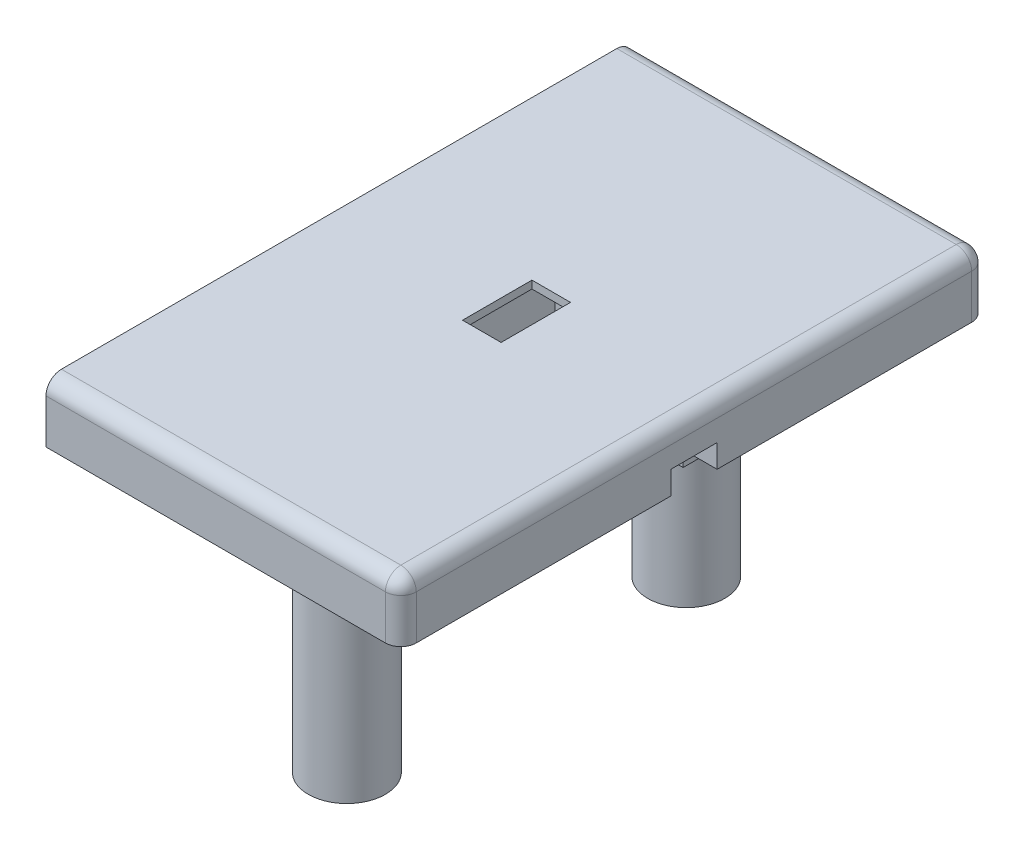
ISO-10303-21;
HEADER;
FILE_DESCRIPTION(('STEP AP214'),'2;1');
FILE_NAME('part.step','',(''),(''),'','','');
FILE_SCHEMA(('AUTOMOTIVE_DESIGN { 1 0 10303 214 1 1 1 1 }'));
ENDSEC;
DATA;
#1=APPLICATION_CONTEXT('core data for automotive mechanical design processes');
#2=APPLICATION_PROTOCOL_DEFINITION('international standard','automotive_design',2000,#1);
#3=PRODUCT_CONTEXT('',#1,'mechanical');
#4=PRODUCT('Part','Part','',(#3));
#5=PRODUCT_RELATED_PRODUCT_CATEGORY('part','',(#4));
#6=PRODUCT_DEFINITION_FORMATION('','',#4);
#7=PRODUCT_DEFINITION_CONTEXT('part definition',#1,'design');
#8=PRODUCT_DEFINITION('design','',#6,#7);
#9=PRODUCT_DEFINITION_SHAPE('','',#8);
#10=(LENGTH_UNIT() NAMED_UNIT(*) SI_UNIT(.MILLI.,.METRE.));
#11=(NAMED_UNIT(*) PLANE_ANGLE_UNIT() SI_UNIT($,.RADIAN.));
#12=(NAMED_UNIT(*) SI_UNIT($,.STERADIAN.) SOLID_ANGLE_UNIT());
#13=UNCERTAINTY_MEASURE_WITH_UNIT(LENGTH_MEASURE(1.E-05),#10,'distance_accuracy_value','');
#14=(GEOMETRIC_REPRESENTATION_CONTEXT(3) GLOBAL_UNCERTAINTY_ASSIGNED_CONTEXT((#13)) GLOBAL_UNIT_ASSIGNED_CONTEXT((#10,
#11,#12)) REPRESENTATION_CONTEXT('',''));
#15=CARTESIAN_POINT('',(0.,0.,0.));
#16=DIRECTION('',(0.,0.,1.));
#17=DIRECTION('',(1.,0.,0.));
#18=AXIS2_PLACEMENT_3D('',#15,#16,#17);
#19=CARTESIAN_POINT('',(9.29999999999999,1.,-16.8));
#20=DIRECTION('',(1.,0.,0.));
#21=DIRECTION('',(0.,0.,-1.));
#22=AXIS2_PLACEMENT_3D('',#19,#20,#21);
#23=PLANE('',#22);
#24=DIRECTION('',(0.,-1.,0.));
#25=VECTOR('',#24,1.);
#26=CARTESIAN_POINT('',(9.29999999999999,1.,1.5));
#27=LINE('',#26,#25);
#28=CARTESIAN_POINT('',(9.29999999999999,1.,1.5));
#29=VERTEX_POINT('',#28);
#30=CARTESIAN_POINT('',(9.29999999999999,0.,1.5));
#31=VERTEX_POINT('',#30);
#32=EDGE_CURVE('E242',#29,#31,#27,.T.);
#33=ORIENTED_EDGE('',*,*,#32,.F.);
#34=DIRECTION('',(0.,0.,1.));
#35=VECTOR('',#34,1.);
#36=CARTESIAN_POINT('',(9.29999999999999,1.,-16.8));
#37=LINE('',#36,#35);
#38=CARTESIAN_POINT('',(9.29999999999999,1.,16.8));
#39=VERTEX_POINT('',#38);
#40=EDGE_CURVE('E334',#29,#39,#37,.T.);
#41=ORIENTED_EDGE('',*,*,#40,.T.);
#42=DIRECTION('',(0.,-1.,0.));
#43=VECTOR('',#42,1.);
#44=CARTESIAN_POINT('',(9.29999999999999,1.,16.8));
#45=LINE('',#44,#43);
#46=CARTESIAN_POINT('',(9.29999999999999,0.,16.8));
#47=VERTEX_POINT('',#46);
#48=EDGE_CURVE('E356',#39,#47,#45,.T.);
#49=ORIENTED_EDGE('',*,*,#48,.T.);
#50=DIRECTION('',(0.,0.,1.));
#51=VECTOR('',#50,1.);
#52=CARTESIAN_POINT('',(9.29999999999999,0.,-16.8));
#53=LINE('',#52,#51);
#54=EDGE_CURVE('E347',#31,#47,#53,.T.);
#55=ORIENTED_EDGE('',*,*,#54,.F.);
#56=EDGE_LOOP('',(#33,#41,#49,#55));
#57=FACE_BOUND('',#56,.T.);
#58=ADVANCED_FACE('F36',(#57),#23,.T.);
#59=CARTESIAN_POINT('',(11.5,4.87,-19.));
#60=DIRECTION('',(-1.,0.,0.));
#61=DIRECTION('',(0.,0.,1.));
#62=AXIS2_PLACEMENT_3D('',#59,#60,#61);
#63=PLANE('',#62);
#64=DIRECTION('',(0.,0.,1.));
#65=VECTOR('',#64,1.);
#66=CARTESIAN_POINT('',(11.5,1.,-19.));
#67=LINE('',#66,#65);
#68=CARTESIAN_POINT('',(11.5,1.,1.5));
#69=VERTEX_POINT('',#68);
#70=CARTESIAN_POINT('',(11.5,1.,18.));
#71=VERTEX_POINT('',#70);
#72=EDGE_CURVE('E366',#69,#71,#67,.T.);
#73=ORIENTED_EDGE('',*,*,#72,.F.);
#74=DIRECTION('',(0.,-1.,0.));
#75=VECTOR('',#74,1.);
#76=CARTESIAN_POINT('',(11.5,2.5,1.5));
#77=LINE('',#76,#75);
#78=CARTESIAN_POINT('',(11.5,2.5,1.5));
#79=VERTEX_POINT('',#78);
#80=EDGE_CURVE('E221',#79,#69,#77,.T.);
#81=ORIENTED_EDGE('',*,*,#80,.F.);
#82=DIRECTION('',(0.,0.,1.));
#83=VECTOR('',#82,1.);
#84=CARTESIAN_POINT('',(11.5,2.5,-1.5));
#85=LINE('',#84,#83);
#86=CARTESIAN_POINT('',(11.5,2.5,-1.5));
#87=VERTEX_POINT('',#86);
#88=EDGE_CURVE('E220',#87,#79,#85,.T.);
#89=ORIENTED_EDGE('',*,*,#88,.F.);
#90=DIRECTION('',(0.,1.,0.));
#91=VECTOR('',#90,1.);
#92=CARTESIAN_POINT('',(11.5,2.5,-1.5));
#93=LINE('',#92,#91);
#94=CARTESIAN_POINT('',(11.5,1.,-1.5));
#95=VERTEX_POINT('',#94);
#96=EDGE_CURVE('E209',#95,#87,#93,.T.);
#97=ORIENTED_EDGE('',*,*,#96,.F.);
#98=CARTESIAN_POINT('',(11.5,1.,-18.));
#99=VERTEX_POINT('',#98);
#100=EDGE_CURVE('E367',#99,#95,#67,.T.);
#101=ORIENTED_EDGE('',*,*,#100,.F.);
#102=DIRECTION('',(0.,-1.,0.));
#103=VECTOR('',#102,1.);
#104=CARTESIAN_POINT('',(11.5,4.87,-18.));
#105=LINE('',#104,#103);
#106=CARTESIAN_POINT('',(11.5,3.87,-18.));
#107=VERTEX_POINT('',#106);
#108=EDGE_CURVE('E395',#99,#107,#105,.F.);
#109=ORIENTED_EDGE('',*,*,#108,.T.);
#110=DIRECTION('',(0.,0.,-1.));
#111=VECTOR('',#110,1.);
#112=CARTESIAN_POINT('',(11.5,3.87,19.));
#113=LINE('',#112,#111);
#114=CARTESIAN_POINT('',(11.5,3.87,18.));
#115=VERTEX_POINT('',#114);
#116=EDGE_CURVE('E390',#107,#115,#113,.F.);
#117=ORIENTED_EDGE('',*,*,#116,.T.);
#118=DIRECTION('',(0.,-1.,0.));
#119=VECTOR('',#118,1.);
#120=CARTESIAN_POINT('',(11.5,4.87,18.));
#121=LINE('',#120,#119);
#122=EDGE_CURVE('E392',#115,#71,#121,.T.);
#123=ORIENTED_EDGE('',*,*,#122,.T.);
#124=EDGE_LOOP('',(#73,#81,#89,#97,#101,#109,#117,#123));
#125=FACE_BOUND('',#124,.T.);
#126=ADVANCED_FACE('F233',(#125),#63,.F.);
#127=CARTESIAN_POINT('',(-11.5,4.87,-19.));
#128=DIRECTION('',(0.,0.,1.));
#129=DIRECTION('',(1.,0.,0.));
#130=AXIS2_PLACEMENT_3D('',#127,#128,#129);
#131=PLANE('',#130);
#132=DIRECTION('',(1.,0.,0.));
#133=VECTOR('',#132,1.);
#134=CARTESIAN_POINT('',(11.5,1.,-19.));
#135=LINE('',#134,#133);
#136=CARTESIAN_POINT('',(-11.5,1.,-19.));
#137=VERTEX_POINT('',#136);
#138=CARTESIAN_POINT('',(10.5,1.,-19.));
#139=VERTEX_POINT('',#138);
#140=EDGE_CURVE('E364',#137,#139,#135,.T.);
#141=ORIENTED_EDGE('',*,*,#140,.F.);
#142=DIRECTION('',(0.,-1.,0.));
#143=VECTOR('',#142,1.);
#144=CARTESIAN_POINT('',(-11.5,4.87,-19.));
#145=LINE('',#144,#143);
#146=CARTESIAN_POINT('',(-11.5,3.87,-19.));
#147=VERTEX_POINT('',#146);
#148=EDGE_CURVE('E382',#147,#137,#145,.T.);
#149=ORIENTED_EDGE('',*,*,#148,.F.);
#150=DIRECTION('',(-1.,0.,0.));
#151=VECTOR('',#150,1.);
#152=CARTESIAN_POINT('',(11.5,3.87,-19.));
#153=LINE('',#152,#151);
#154=CARTESIAN_POINT('',(10.5,3.87,-19.));
#155=VERTEX_POINT('',#154);
#156=EDGE_CURVE('E385',#147,#155,#153,.F.);
#157=ORIENTED_EDGE('',*,*,#156,.T.);
#158=DIRECTION('',(0.,-1.,0.));
#159=VECTOR('',#158,1.);
#160=CARTESIAN_POINT('',(10.5,4.87,-19.));
#161=LINE('',#160,#159);
#162=EDGE_CURVE('E387',#155,#139,#161,.T.);
#163=ORIENTED_EDGE('',*,*,#162,.T.);
#164=EDGE_LOOP('',(#141,#149,#157,#163));
#165=FACE_BOUND('',#164,.T.);
#166=ADVANCED_FACE('F487',(#165),#131,.F.);
#167=CARTESIAN_POINT('',(-11.5,4.87,-19.));
#168=DIRECTION('',(1.,0.,0.));
#169=DIRECTION('',(0.,0.,-1.));
#170=AXIS2_PLACEMENT_3D('',#167,#168,#169);
#171=PLANE('',#170);
#172=DIRECTION('',(0.,0.,-1.));
#173=VECTOR('',#172,1.);
#174=CARTESIAN_POINT('',(-11.5,1.,-19.));
#175=LINE('',#174,#173);
#176=CARTESIAN_POINT('',(-11.5,1.,19.));
#177=VERTEX_POINT('',#176);
#178=EDGE_CURVE('E355',#177,#137,#175,.T.);
#179=ORIENTED_EDGE('',*,*,#178,.F.);
#180=DIRECTION('',(0.,-1.,0.));
#181=VECTOR('',#180,1.);
#182=CARTESIAN_POINT('',(-11.5,4.87,19.));
#183=LINE('',#182,#181);
#184=CARTESIAN_POINT('',(-11.5,3.87,19.));
#185=VERTEX_POINT('',#184);
#186=EDGE_CURVE('E378',#185,#177,#183,.T.);
#187=ORIENTED_EDGE('',*,*,#186,.F.);
#188=CARTESIAN_POINT('',(-11.5,3.87,18.));
#189=DIRECTION('',(1.,0.,0.));
#190=DIRECTION('',(0.,0.,-1.));
#191=AXIS2_PLACEMENT_3D('',#188,#189,#190);
#192=CIRCLE('',#191,1.);
#193=CARTESIAN_POINT('',(-11.5,4.87,18.));
#194=VERTEX_POINT('',#193);
#195=EDGE_CURVE('E409',#185,#194,#192,.F.);
#196=ORIENTED_EDGE('',*,*,#195,.T.);
#197=DIRECTION('',(0.,0.,1.));
#198=VECTOR('',#197,1.);
#199=CARTESIAN_POINT('',(-11.5,4.87,-19.));
#200=LINE('',#199,#198);
#201=CARTESIAN_POINT('',(-11.5,4.87,-18.));
#202=VERTEX_POINT('',#201);
#203=EDGE_CURVE('E375',#202,#194,#200,.T.);
#204=ORIENTED_EDGE('',*,*,#203,.F.);
#205=CARTESIAN_POINT('',(-11.5,3.87,-18.));
#206=DIRECTION('',(1.,0.,0.));
#207=DIRECTION('',(0.,0.,-1.));
#208=AXIS2_PLACEMENT_3D('',#205,#206,#207);
#209=CIRCLE('',#208,1.);
#210=EDGE_CURVE('E407',#202,#147,#209,.F.);
#211=ORIENTED_EDGE('',*,*,#210,.T.);
#212=ORIENTED_EDGE('',*,*,#148,.T.);
#213=EDGE_LOOP('',(#179,#187,#196,#204,#211,#212));
#214=FACE_BOUND('',#213,.T.);
#215=ADVANCED_FACE('F482',(#214),#171,.F.);
#216=CARTESIAN_POINT('',(-11.5,4.87,19.));
#217=DIRECTION('',(0.,0.,-1.));
#218=DIRECTION('',(-1.,0.,0.));
#219=AXIS2_PLACEMENT_3D('',#216,#217,#218);
#220=PLANE('',#219);
#221=DIRECTION('',(-1.,0.,0.));
#222=VECTOR('',#221,1.);
#223=CARTESIAN_POINT('',(11.5,1.,19.));
#224=LINE('',#223,#222);
#225=CARTESIAN_POINT('',(10.5,1.,19.));
#226=VERTEX_POINT('',#225);
#227=EDGE_CURVE('E369',#226,#177,#224,.T.);
#228=ORIENTED_EDGE('',*,*,#227,.F.);
#229=DIRECTION('',(0.,-1.,0.));
#230=VECTOR('',#229,1.);
#231=CARTESIAN_POINT('',(10.5,4.87,19.));
#232=LINE('',#231,#230);
#233=CARTESIAN_POINT('',(10.5,3.87,19.));
#234=VERTEX_POINT('',#233);
#235=EDGE_CURVE('E399',#226,#234,#232,.F.);
#236=ORIENTED_EDGE('',*,*,#235,.T.);
#237=DIRECTION('',(1.,0.,0.));
#238=VECTOR('',#237,1.);
#239=CARTESIAN_POINT('',(-11.5,3.87,19.));
#240=LINE('',#239,#238);
#241=EDGE_CURVE('E397',#234,#185,#240,.F.);
#242=ORIENTED_EDGE('',*,*,#241,.T.);
#243=ORIENTED_EDGE('',*,*,#186,.T.);
#244=EDGE_LOOP('',(#228,#236,#242,#243));
#245=FACE_BOUND('',#244,.T.);
#246=ADVANCED_FACE('F479',(#245),#220,.F.);
#247=CARTESIAN_POINT('',(10.5,4.87,18.));
#248=DIRECTION('',(0.,-1.,0.));
#249=DIRECTION('',(0.,0.,-1.));
#250=AXIS2_PLACEMENT_3D('',#247,#248,#249);
#251=CYLINDRICAL_SURFACE('',#250,1.);
#252=ORIENTED_EDGE('',*,*,#235,.F.);
#253=CARTESIAN_POINT('',(10.5,1.,18.));
#254=DIRECTION('',(0.,-1.,0.));
#255=DIRECTION('',(0.,0.,-1.));
#256=AXIS2_PLACEMENT_3D('',#253,#254,#255);
#257=CIRCLE('',#256,1.);
#258=EDGE_CURVE('E371',#226,#71,#257,.F.);
#259=ORIENTED_EDGE('',*,*,#258,.T.);
#260=ORIENTED_EDGE('',*,*,#122,.F.);
#261=CARTESIAN_POINT('',(10.5,3.87,18.));
#262=DIRECTION('',(0.,1.,0.));
#263=DIRECTION('',(0.,0.,1.));
#264=AXIS2_PLACEMENT_3D('',#261,#262,#263);
#265=CIRCLE('',#264,1.);
#266=EDGE_CURVE('E379',#234,#115,#265,.T.);
#267=ORIENTED_EDGE('',*,*,#266,.F.);
#268=EDGE_LOOP('',(#252,#259,#260,#267));
#269=FACE_BOUND('',#268,.T.);
#270=ADVANCED_FACE('F38',(#269),#251,.T.);
#271=CARTESIAN_POINT('',(10.5,4.87,-18.));
#272=DIRECTION('',(0.,-1.,0.));
#273=DIRECTION('',(0.,0.,-1.));
#274=AXIS2_PLACEMENT_3D('',#271,#272,#273);
#275=CYLINDRICAL_SURFACE('',#274,1.);
#276=ORIENTED_EDGE('',*,*,#108,.F.);
#277=CARTESIAN_POINT('',(10.5,1.,-18.));
#278=DIRECTION('',(0.,-1.,0.));
#279=DIRECTION('',(0.,0.,-1.));
#280=AXIS2_PLACEMENT_3D('',#277,#278,#279);
#281=CIRCLE('',#280,1.);
#282=EDGE_CURVE('E411',#99,#139,#281,.F.);
#283=ORIENTED_EDGE('',*,*,#282,.T.);
#284=ORIENTED_EDGE('',*,*,#162,.F.);
#285=CARTESIAN_POINT('',(10.5,3.87,-18.));
#286=DIRECTION('',(0.,1.,0.));
#287=DIRECTION('',(0.,0.,1.));
#288=AXIS2_PLACEMENT_3D('',#285,#286,#287);
#289=CIRCLE('',#288,1.);
#290=EDGE_CURVE('E374',#155,#107,#289,.F.);
#291=ORIENTED_EDGE('',*,*,#290,.T.);
#292=EDGE_LOOP('',(#276,#283,#284,#291));
#293=FACE_BOUND('',#292,.T.);
#294=ADVANCED_FACE('F453',(#293),#275,.T.);
#295=CARTESIAN_POINT('',(0.,4.87,0.));
#296=DIRECTION('',(0.,1.,0.));
#297=DIRECTION('',(0.,0.,1.));
#298=AXIS2_PLACEMENT_3D('',#295,#296,#297);
#299=PLANE('',#298);
#300=DIRECTION('',(0.,0.,-1.));
#301=VECTOR('',#300,1.);
#302=CARTESIAN_POINT('',(-1.25,4.87,-2.25));
#303=LINE('',#302,#301);
#304=CARTESIAN_POINT('',(-1.25,4.87,2.25));
#305=VERTEX_POINT('',#304);
#306=CARTESIAN_POINT('',(-1.25,4.87,-2.25));
#307=VERTEX_POINT('',#306);
#308=EDGE_CURVE('E270',#305,#307,#303,.T.);
#309=ORIENTED_EDGE('',*,*,#308,.T.);
#310=DIRECTION('',(1.,0.,0.));
#311=VECTOR('',#310,1.);
#312=CARTESIAN_POINT('',(1.25,4.87,-2.25));
#313=LINE('',#312,#311);
#314=CARTESIAN_POINT('',(1.25,4.87,-2.25));
#315=VERTEX_POINT('',#314);
#316=EDGE_CURVE('E286',#307,#315,#313,.T.);
#317=ORIENTED_EDGE('',*,*,#316,.T.);
#318=DIRECTION('',(0.,0.,1.));
#319=VECTOR('',#318,1.);
#320=CARTESIAN_POINT('',(1.25,4.87,-2.25));
#321=LINE('',#320,#319);
#322=CARTESIAN_POINT('',(1.25,4.87,2.25));
#323=VERTEX_POINT('',#322);
#324=EDGE_CURVE('E264',#315,#323,#321,.T.);
#325=ORIENTED_EDGE('',*,*,#324,.T.);
#326=DIRECTION('',(-1.,0.,0.));
#327=VECTOR('',#326,1.);
#328=CARTESIAN_POINT('',(1.25,4.87,2.25));
#329=LINE('',#328,#327);
#330=EDGE_CURVE('E267',#323,#305,#329,.T.);
#331=ORIENTED_EDGE('',*,*,#330,.T.);
#332=EDGE_LOOP('',(#309,#317,#325,#331));
#333=FACE_BOUND('',#332,.T.);
#334=ORIENTED_EDGE('',*,*,#203,.T.);
#335=DIRECTION('',(1.,0.,0.));
#336=VECTOR('',#335,1.);
#337=CARTESIAN_POINT('',(11.5,4.87,18.));
#338=LINE('',#337,#336);
#339=CARTESIAN_POINT('',(10.5,4.87,18.));
#340=VERTEX_POINT('',#339);
#341=EDGE_CURVE('E405',#194,#340,#338,.T.);
#342=ORIENTED_EDGE('',*,*,#341,.T.);
#343=DIRECTION('',(0.,0.,-1.));
#344=VECTOR('',#343,1.);
#345=CARTESIAN_POINT('',(10.5,4.87,-19.));
#346=LINE('',#345,#344);
#347=CARTESIAN_POINT('',(10.5,4.87,-18.));
#348=VERTEX_POINT('',#347);
#349=EDGE_CURVE('E403',#340,#348,#346,.T.);
#350=ORIENTED_EDGE('',*,*,#349,.T.);
#351=DIRECTION('',(-1.,0.,0.));
#352=VECTOR('',#351,1.);
#353=CARTESIAN_POINT('',(-11.5,4.87,-18.));
#354=LINE('',#353,#352);
#355=EDGE_CURVE('E401',#348,#202,#354,.T.);
#356=ORIENTED_EDGE('',*,*,#355,.T.);
#357=EDGE_LOOP('',(#334,#342,#350,#356));
#358=FACE_BOUND('',#357,.T.);
#359=ADVANCED_FACE('F494',(#333,#358),#299,.T.);
#360=CARTESIAN_POINT('',(0.,3.87,18.));
#361=DIRECTION('',(-1.,0.,0.));
#362=DIRECTION('',(0.,0.,1.));
#363=AXIS2_PLACEMENT_3D('',#360,#361,#362);
#364=CYLINDRICAL_SURFACE('',#363,1.);
#365=ORIENTED_EDGE('',*,*,#195,.F.);
#366=ORIENTED_EDGE('',*,*,#241,.F.);
#367=CARTESIAN_POINT('',(10.5,3.87,18.));
#368=DIRECTION('',(1.,0.,0.));
#369=DIRECTION('',(0.,0.,-1.));
#370=AXIS2_PLACEMENT_3D('',#367,#368,#369);
#371=CIRCLE('',#370,1.);
#372=EDGE_CURVE('E423',#340,#234,#371,.T.);
#373=ORIENTED_EDGE('',*,*,#372,.F.);
#374=ORIENTED_EDGE('',*,*,#341,.F.);
#375=EDGE_LOOP('',(#365,#366,#373,#374));
#376=FACE_BOUND('',#375,.T.);
#377=ADVANCED_FACE('F475',(#376),#364,.T.);
#378=CARTESIAN_POINT('',(10.5,3.87,18.));
#379=DIRECTION('',(0.,0.,1.));
#380=DIRECTION('',(1.,0.,0.));
#381=AXIS2_PLACEMENT_3D('',#378,#379,#380);
#382=SPHERICAL_SURFACE('',#381,1.);
#383=ORIENTED_EDGE('',*,*,#372,.T.);
#384=ORIENTED_EDGE('',*,*,#266,.T.);
#385=CARTESIAN_POINT('',(10.5,3.87,18.));
#386=DIRECTION('',(0.,0.,1.));
#387=DIRECTION('',(1.,0.,0.));
#388=AXIS2_PLACEMENT_3D('',#385,#386,#387);
#389=CIRCLE('',#388,1.);
#390=EDGE_CURVE('E420',#340,#115,#389,.F.);
#391=ORIENTED_EDGE('',*,*,#390,.F.);
#392=EDGE_LOOP('',(#383,#384,#391));
#393=FACE_BOUND('',#392,.T.);
#394=ADVANCED_FACE('F469',(#393),#382,.T.);
#395=CARTESIAN_POINT('',(10.5,3.87,0.));
#396=DIRECTION('',(0.,0.,1.));
#397=DIRECTION('',(1.,0.,0.));
#398=AXIS2_PLACEMENT_3D('',#395,#396,#397);
#399=CYLINDRICAL_SURFACE('',#398,1.);
#400=ORIENTED_EDGE('',*,*,#390,.T.);
#401=ORIENTED_EDGE('',*,*,#116,.F.);
#402=CARTESIAN_POINT('',(10.5,3.87,-18.));
#403=DIRECTION('',(0.,0.,-1.));
#404=DIRECTION('',(-1.,0.,0.));
#405=AXIS2_PLACEMENT_3D('',#402,#403,#404);
#406=CIRCLE('',#405,1.);
#407=EDGE_CURVE('E417',#348,#107,#406,.T.);
#408=ORIENTED_EDGE('',*,*,#407,.F.);
#409=ORIENTED_EDGE('',*,*,#349,.F.);
#410=EDGE_LOOP('',(#400,#401,#408,#409));
#411=FACE_BOUND('',#410,.T.);
#412=ADVANCED_FACE('F462',(#411),#399,.T.);
#413=CARTESIAN_POINT('',(0.,3.87,-18.));
#414=DIRECTION('',(1.,0.,0.));
#415=DIRECTION('',(0.,0.,-1.));
#416=AXIS2_PLACEMENT_3D('',#413,#414,#415);
#417=CYLINDRICAL_SURFACE('',#416,1.);
#418=ORIENTED_EDGE('',*,*,#210,.F.);
#419=ORIENTED_EDGE('',*,*,#355,.F.);
#420=CARTESIAN_POINT('',(10.5,3.87,-18.));
#421=DIRECTION('',(1.,0.,0.));
#422=DIRECTION('',(0.,0.,-1.));
#423=AXIS2_PLACEMENT_3D('',#420,#421,#422);
#424=CIRCLE('',#423,1.);
#425=EDGE_CURVE('E414',#155,#348,#424,.T.);
#426=ORIENTED_EDGE('',*,*,#425,.F.);
#427=ORIENTED_EDGE('',*,*,#156,.F.);
#428=EDGE_LOOP('',(#418,#419,#426,#427));
#429=FACE_BOUND('',#428,.T.);
#430=ADVANCED_FACE('F492',(#429),#417,.T.);
#431=CARTESIAN_POINT('',(10.5,3.87,-18.));
#432=DIRECTION('',(0.,0.,1.));
#433=DIRECTION('',(1.,0.,0.));
#434=AXIS2_PLACEMENT_3D('',#431,#432,#433);
#435=SPHERICAL_SURFACE('',#434,1.);
#436=ORIENTED_EDGE('',*,*,#425,.T.);
#437=ORIENTED_EDGE('',*,*,#407,.T.);
#438=ORIENTED_EDGE('',*,*,#290,.F.);
#439=EDGE_LOOP('',(#436,#437,#438));
#440=FACE_BOUND('',#439,.T.);
#441=ADVANCED_FACE('F457',(#440),#435,.T.);
#442=CARTESIAN_POINT('',(0.,1.,0.));
#443=DIRECTION('',(0.,-1.,0.));
#444=DIRECTION('',(0.,0.,-1.));
#445=AXIS2_PLACEMENT_3D('',#442,#443,#444);
#446=PLANE('',#445);
#447=DIRECTION('',(-1.,0.,0.));
#448=VECTOR('',#447,1.);
#449=CARTESIAN_POINT('',(0.,1.,1.5));
#450=LINE('',#449,#448);
#451=EDGE_CURVE('E244',#69,#29,#450,.T.);
#452=ORIENTED_EDGE('',*,*,#451,.F.);
#453=ORIENTED_EDGE('',*,*,#72,.T.);
#454=ORIENTED_EDGE('',*,*,#258,.F.);
#455=ORIENTED_EDGE('',*,*,#227,.T.);
#456=ORIENTED_EDGE('',*,*,#178,.T.);
#457=ORIENTED_EDGE('',*,*,#140,.T.);
#458=ORIENTED_EDGE('',*,*,#282,.F.);
#459=ORIENTED_EDGE('',*,*,#100,.T.);
#460=DIRECTION('',(1.,0.,0.));
#461=VECTOR('',#460,1.);
#462=CARTESIAN_POINT('',(0.,1.,-1.5));
#463=LINE('',#462,#461);
#464=CARTESIAN_POINT('',(9.29999999999999,1.,-1.5));
#465=VERTEX_POINT('',#464);
#466=EDGE_CURVE('E215',#465,#95,#463,.T.);
#467=ORIENTED_EDGE('',*,*,#466,.F.);
#468=CARTESIAN_POINT('',(9.29999999999999,1.,-16.8));
#469=VERTEX_POINT('',#468);
#470=EDGE_CURVE('E335',#469,#465,#37,.T.);
#471=ORIENTED_EDGE('',*,*,#470,.F.);
#472=DIRECTION('',(1.,0.,0.));
#473=VECTOR('',#472,1.);
#474=CARTESIAN_POINT('',(9.29999999999999,1.,-16.8));
#475=LINE('',#474,#473);
#476=CARTESIAN_POINT('',(-9.29999999999999,1.,-16.8));
#477=VERTEX_POINT('',#476);
#478=EDGE_CURVE('E330',#477,#469,#475,.T.);
#479=ORIENTED_EDGE('',*,*,#478,.F.);
#480=DIRECTION('',(0.,0.,-1.));
#481=VECTOR('',#480,1.);
#482=CARTESIAN_POINT('',(-9.29999999999999,1.,-16.8));
#483=LINE('',#482,#481);
#484=CARTESIAN_POINT('',(-9.29999999999999,1.,16.8));
#485=VERTEX_POINT('',#484);
#486=EDGE_CURVE('E327',#485,#477,#483,.T.);
#487=ORIENTED_EDGE('',*,*,#486,.F.);
#488=DIRECTION('',(-1.,0.,0.));
#489=VECTOR('',#488,1.);
#490=CARTESIAN_POINT('',(9.29999999999999,1.,16.8));
#491=LINE('',#490,#489);
#492=EDGE_CURVE('E338',#39,#485,#491,.T.);
#493=ORIENTED_EDGE('',*,*,#492,.F.);
#494=ORIENTED_EDGE('',*,*,#40,.F.);
#495=EDGE_LOOP('',(#452,#453,#454,#455,#456,#457,#458,#459,#467,#471,#479,#487,#493,#494));
#496=FACE_BOUND('',#495,.T.);
#497=ADVANCED_FACE('F448',(#496),#446,.T.);
#498=CARTESIAN_POINT('',(-9.29999999999999,1.,-16.8));
#499=DIRECTION('',(-1.,0.,0.));
#500=DIRECTION('',(0.,0.,1.));
#501=AXIS2_PLACEMENT_3D('',#498,#499,#500);
#502=PLANE('',#501);
#503=DIRECTION('',(0.,0.,-1.));
#504=VECTOR('',#503,1.);
#505=CARTESIAN_POINT('',(-9.29999999999999,0.,-16.8));
#506=LINE('',#505,#504);
#507=CARTESIAN_POINT('',(-9.29999999999999,0.,16.8));
#508=VERTEX_POINT('',#507);
#509=CARTESIAN_POINT('',(-9.29999999999999,0.,-16.8));
#510=VERTEX_POINT('',#509);
#511=EDGE_CURVE('E326',#508,#510,#506,.T.);
#512=ORIENTED_EDGE('',*,*,#511,.F.);
#513=DIRECTION('',(0.,-1.,0.));
#514=VECTOR('',#513,1.);
#515=CARTESIAN_POINT('',(-9.29999999999999,1.,16.8));
#516=LINE('',#515,#514);
#517=EDGE_CURVE('E353',#485,#508,#516,.T.);
#518=ORIENTED_EDGE('',*,*,#517,.F.);
#519=ORIENTED_EDGE('',*,*,#486,.T.);
#520=DIRECTION('',(0.,-1.,0.));
#521=VECTOR('',#520,1.);
#522=CARTESIAN_POINT('',(-9.29999999999999,1.,-16.8));
#523=LINE('',#522,#521);
#524=EDGE_CURVE('E341',#477,#510,#523,.T.);
#525=ORIENTED_EDGE('',*,*,#524,.T.);
#526=EDGE_LOOP('',(#512,#518,#519,#525));
#527=FACE_BOUND('',#526,.T.);
#528=ADVANCED_FACE('F523',(#527),#502,.T.);
#529=CARTESIAN_POINT('',(9.29999999999999,1.,16.8));
#530=DIRECTION('',(0.,0.,1.));
#531=DIRECTION('',(1.,0.,0.));
#532=AXIS2_PLACEMENT_3D('',#529,#530,#531);
#533=PLANE('',#532);
#534=DIRECTION('',(-1.,0.,0.));
#535=VECTOR('',#534,1.);
#536=CARTESIAN_POINT('',(9.29999999999999,0.,16.8));
#537=LINE('',#536,#535);
#538=EDGE_CURVE('E331',#47,#508,#537,.T.);
#539=ORIENTED_EDGE('',*,*,#538,.F.);
#540=ORIENTED_EDGE('',*,*,#48,.F.);
#541=ORIENTED_EDGE('',*,*,#492,.T.);
#542=ORIENTED_EDGE('',*,*,#517,.T.);
#543=EDGE_LOOP('',(#539,#540,#541,#542));
#544=FACE_BOUND('',#543,.T.);
#545=ADVANCED_FACE('F517',(#544),#533,.T.);
#546=DIRECTION('',(0.,1.,0.));
#547=VECTOR('',#546,1.);
#548=CARTESIAN_POINT('',(9.29999999999999,1.,-1.5));
#549=LINE('',#548,#547);
#550=CARTESIAN_POINT('',(9.29999999999999,0.,-1.5));
#551=VERTEX_POINT('',#550);
#552=EDGE_CURVE('E239',#551,#465,#549,.T.);
#553=ORIENTED_EDGE('',*,*,#552,.F.);
#554=CARTESIAN_POINT('',(9.29999999999999,0.,-16.8));
#555=VERTEX_POINT('',#554);
#556=EDGE_CURVE('E348',#555,#551,#53,.T.);
#557=ORIENTED_EDGE('',*,*,#556,.F.);
#558=DIRECTION('',(0.,-1.,0.));
#559=VECTOR('',#558,1.);
#560=CARTESIAN_POINT('',(9.29999999999999,1.,-16.8));
#561=LINE('',#560,#559);
#562=EDGE_CURVE('E359',#469,#555,#561,.T.);
#563=ORIENTED_EDGE('',*,*,#562,.F.);
#564=ORIENTED_EDGE('',*,*,#470,.T.);
#565=EDGE_LOOP('',(#553,#557,#563,#564));
#566=FACE_BOUND('',#565,.T.);
#567=ADVANCED_FACE('F443',(#566),#23,.T.);
#568=CARTESIAN_POINT('',(9.29999999999999,1.,-16.8));
#569=DIRECTION('',(0.,0.,-1.));
#570=DIRECTION('',(-1.,0.,0.));
#571=AXIS2_PLACEMENT_3D('',#568,#569,#570);
#572=PLANE('',#571);
#573=DIRECTION('',(1.,0.,0.));
#574=VECTOR('',#573,1.);
#575=CARTESIAN_POINT('',(9.29999999999999,0.,-16.8));
#576=LINE('',#575,#574);
#577=EDGE_CURVE('E344',#510,#555,#576,.T.);
#578=ORIENTED_EDGE('',*,*,#577,.F.);
#579=ORIENTED_EDGE('',*,*,#524,.F.);
#580=ORIENTED_EDGE('',*,*,#478,.T.);
#581=ORIENTED_EDGE('',*,*,#562,.T.);
#582=EDGE_LOOP('',(#578,#579,#580,#581));
#583=FACE_BOUND('',#582,.T.);
#584=ADVANCED_FACE('F516',(#583),#572,.T.);
#585=CARTESIAN_POINT('',(0.,0.,0.));
#586=DIRECTION('',(0.,1.,0.));
#587=DIRECTION('',(0.,0.,1.));
#588=AXIS2_PLACEMENT_3D('',#585,#586,#587);
#589=PLANE('',#588);
#590=CARTESIAN_POINT('',(0.,0.,11.));
#591=DIRECTION('',(0.,1.,0.));
#592=DIRECTION('',(0.,0.,1.));
#593=AXIS2_PLACEMENT_3D('',#590,#591,#592);
#594=CIRCLE('',#593,2.5);
#595=CARTESIAN_POINT('',(0.,0.,13.5));
#596=VERTEX_POINT('',#595);
#597=EDGE_CURVE('E433',#596,#596,#594,.F.);
#598=ORIENTED_EDGE('',*,*,#597,.F.);
#599=EDGE_LOOP('',(#598));
#600=FACE_BOUND('',#599,.T.);
#601=CARTESIAN_POINT('',(0.,0.,-11.));
#602=DIRECTION('',(0.,1.,0.));
#603=DIRECTION('',(0.,0.,1.));
#604=AXIS2_PLACEMENT_3D('',#601,#602,#603);
#605=CIRCLE('',#604,2.5);
#606=CARTESIAN_POINT('',(0.,0.,-8.5));
#607=VERTEX_POINT('',#606);
#608=EDGE_CURVE('E430',#607,#607,#605,.F.);
#609=ORIENTED_EDGE('',*,*,#608,.F.);
#610=EDGE_LOOP('',(#609));
#611=FACE_BOUND('',#610,.T.);
#612=DIRECTION('',(0.,0.,1.));
#613=VECTOR('',#612,1.);
#614=CARTESIAN_POINT('',(2.5,0.,-5.));
#615=LINE('',#614,#613);
#616=CARTESIAN_POINT('',(2.5,0.,-5.));
#617=VERTEX_POINT('',#616);
#618=CARTESIAN_POINT('',(2.5,0.,5.));
#619=VERTEX_POINT('',#618);
#620=EDGE_CURVE('E298',#617,#619,#615,.T.);
#621=ORIENTED_EDGE('',*,*,#620,.F.);
#622=DIRECTION('',(1.,0.,0.));
#623=VECTOR('',#622,1.);
#624=CARTESIAN_POINT('',(2.5,0.,-5.));
#625=LINE('',#624,#623);
#626=CARTESIAN_POINT('',(-2.5,0.,-5.));
#627=VERTEX_POINT('',#626);
#628=EDGE_CURVE('E301',#627,#617,#625,.T.);
#629=ORIENTED_EDGE('',*,*,#628,.F.);
#630=DIRECTION('',(0.,0.,-1.));
#631=VECTOR('',#630,1.);
#632=CARTESIAN_POINT('',(-2.5,0.,-5.));
#633=LINE('',#632,#631);
#634=CARTESIAN_POINT('',(-2.5,0.,5.));
#635=VERTEX_POINT('',#634);
#636=EDGE_CURVE('E294',#635,#627,#633,.T.);
#637=ORIENTED_EDGE('',*,*,#636,.F.);
#638=DIRECTION('',(-1.,0.,0.));
#639=VECTOR('',#638,1.);
#640=CARTESIAN_POINT('',(2.5,0.,5.));
#641=LINE('',#640,#639);
#642=EDGE_CURVE('E295',#619,#635,#641,.T.);
#643=ORIENTED_EDGE('',*,*,#642,.F.);
#644=EDGE_LOOP('',(#621,#629,#637,#643));
#645=FACE_BOUND('',#644,.T.);
#646=DIRECTION('',(0.,0.,-1.));
#647=VECTOR('',#646,1.);
#648=CARTESIAN_POINT('',(7.29999999999999,0.,0.));
#649=LINE('',#648,#647);
#650=CARTESIAN_POINT('',(7.29999999999999,0.,1.5));
#651=VERTEX_POINT('',#650);
#652=CARTESIAN_POINT('',(7.29999999999999,0.,-1.5));
#653=VERTEX_POINT('',#652);
#654=EDGE_CURVE('E436',#651,#653,#649,.T.);
#655=ORIENTED_EDGE('',*,*,#654,.F.);
#656=DIRECTION('',(1.,0.,0.));
#657=VECTOR('',#656,1.);
#658=CARTESIAN_POINT('',(0.,0.,1.5));
#659=LINE('',#658,#657);
#660=EDGE_CURVE('E13',#651,#31,#659,.T.);
#661=ORIENTED_EDGE('',*,*,#660,.T.);
#662=ORIENTED_EDGE('',*,*,#54,.T.);
#663=ORIENTED_EDGE('',*,*,#538,.T.);
#664=ORIENTED_EDGE('',*,*,#511,.T.);
#665=ORIENTED_EDGE('',*,*,#577,.T.);
#666=ORIENTED_EDGE('',*,*,#556,.T.);
#667=DIRECTION('',(-1.,0.,0.));
#668=VECTOR('',#667,1.);
#669=CARTESIAN_POINT('',(0.,0.,-1.5));
#670=LINE('',#669,#668);
#671=EDGE_CURVE('E44',#551,#653,#670,.T.);
#672=ORIENTED_EDGE('',*,*,#671,.T.);
#673=EDGE_LOOP('',(#655,#661,#662,#663,#664,#665,#666,#672));
#674=FACE_BOUND('',#673,.T.);
#675=ADVANCED_FACE('F440',(#600,#611,#645,#674),#589,.F.);
#676=CARTESIAN_POINT('',(0.,4.37,0.));
#677=DIRECTION('',(0.,1.,0.));
#678=DIRECTION('',(0.,0.,1.));
#679=AXIS2_PLACEMENT_3D('',#676,#677,#678);
#680=PLANE('',#679);
#681=DIRECTION('',(1.,0.,0.));
#682=VECTOR('',#681,1.);
#683=CARTESIAN_POINT('',(1.25,4.37,-2.25));
#684=LINE('',#683,#682);
#685=CARTESIAN_POINT('',(-1.25,4.37,-2.25));
#686=VERTEX_POINT('',#685);
#687=CARTESIAN_POINT('',(1.25,4.37,-2.25));
#688=VERTEX_POINT('',#687);
#689=EDGE_CURVE('E275',#686,#688,#684,.T.);
#690=ORIENTED_EDGE('',*,*,#689,.F.);
#691=DIRECTION('',(0.,0.,-1.));
#692=VECTOR('',#691,1.);
#693=CARTESIAN_POINT('',(-1.25,4.37,-2.25));
#694=LINE('',#693,#692);
#695=CARTESIAN_POINT('',(-1.25,4.37,2.25));
#696=VERTEX_POINT('',#695);
#697=EDGE_CURVE('E273',#696,#686,#694,.T.);
#698=ORIENTED_EDGE('',*,*,#697,.F.);
#699=DIRECTION('',(-1.,0.,0.));
#700=VECTOR('',#699,1.);
#701=CARTESIAN_POINT('',(1.25,4.37,2.25));
#702=LINE('',#701,#700);
#703=CARTESIAN_POINT('',(1.25,4.37,2.25));
#704=VERTEX_POINT('',#703);
#705=EDGE_CURVE('E280',#704,#696,#702,.T.);
#706=ORIENTED_EDGE('',*,*,#705,.F.);
#707=DIRECTION('',(0.,0.,1.));
#708=VECTOR('',#707,1.);
#709=CARTESIAN_POINT('',(1.25,4.37,-2.25));
#710=LINE('',#709,#708);
#711=EDGE_CURVE('E277',#688,#704,#710,.T.);
#712=ORIENTED_EDGE('',*,*,#711,.F.);
#713=EDGE_LOOP('',(#690,#698,#706,#712));
#714=FACE_BOUND('',#713,.T.);
#715=DIRECTION('',(0.,0.,-1.));
#716=VECTOR('',#715,1.);
#717=CARTESIAN_POINT('',(-2.5,4.37,-5.));
#718=LINE('',#717,#716);
#719=CARTESIAN_POINT('',(-2.5,4.37,5.));
#720=VERTEX_POINT('',#719);
#721=CARTESIAN_POINT('',(-2.5,4.37,-5.));
#722=VERTEX_POINT('',#721);
#723=EDGE_CURVE('E309',#720,#722,#718,.T.);
#724=ORIENTED_EDGE('',*,*,#723,.T.);
#725=DIRECTION('',(1.,0.,0.));
#726=VECTOR('',#725,1.);
#727=CARTESIAN_POINT('',(2.5,4.37,-5.));
#728=LINE('',#727,#726);
#729=CARTESIAN_POINT('',(2.5,4.37,-5.));
#730=VERTEX_POINT('',#729);
#731=EDGE_CURVE('E297',#722,#730,#728,.T.);
#732=ORIENTED_EDGE('',*,*,#731,.T.);
#733=DIRECTION('',(0.,0.,1.));
#734=VECTOR('',#733,1.);
#735=CARTESIAN_POINT('',(2.5,4.37,-5.));
#736=LINE('',#735,#734);
#737=CARTESIAN_POINT('',(2.5,4.37,5.));
#738=VERTEX_POINT('',#737);
#739=EDGE_CURVE('E318',#730,#738,#736,.T.);
#740=ORIENTED_EDGE('',*,*,#739,.T.);
#741=DIRECTION('',(-1.,0.,0.));
#742=VECTOR('',#741,1.);
#743=CARTESIAN_POINT('',(2.5,4.37,5.));
#744=LINE('',#743,#742);
#745=EDGE_CURVE('E314',#738,#720,#744,.T.);
#746=ORIENTED_EDGE('',*,*,#745,.T.);
#747=EDGE_LOOP('',(#724,#732,#740,#746));
#748=FACE_BOUND('',#747,.T.);
#749=ADVANCED_FACE('F532',(#714,#748),#680,.F.);
#750=CARTESIAN_POINT('',(2.5,16.050339887499,-5.));
#751=DIRECTION('',(0.,0.,-1.));
#752=DIRECTION('',(-1.,0.,0.));
#753=AXIS2_PLACEMENT_3D('',#750,#751,#752);
#754=PLANE('',#753);
#755=DIRECTION('',(0.,-1.,0.));
#756=VECTOR('',#755,1.);
#757=CARTESIAN_POINT('',(-2.5,16.050339887499,-5.));
#758=LINE('',#757,#756);
#759=EDGE_CURVE('E312',#722,#627,#758,.T.);
#760=ORIENTED_EDGE('',*,*,#759,.T.);
#761=ORIENTED_EDGE('',*,*,#628,.T.);
#762=DIRECTION('',(0.,-1.,0.));
#763=VECTOR('',#762,1.);
#764=CARTESIAN_POINT('',(2.5,16.050339887499,-5.));
#765=LINE('',#764,#763);
#766=EDGE_CURVE('E308',#730,#617,#765,.T.);
#767=ORIENTED_EDGE('',*,*,#766,.F.);
#768=ORIENTED_EDGE('',*,*,#731,.F.);
#769=EDGE_LOOP('',(#760,#761,#767,#768));
#770=FACE_BOUND('',#769,.T.);
#771=ADVANCED_FACE('F535',(#770),#754,.F.);
#772=CARTESIAN_POINT('',(2.5,16.050339887499,-5.));
#773=DIRECTION('',(1.,0.,0.));
#774=DIRECTION('',(0.,0.,-1.));
#775=AXIS2_PLACEMENT_3D('',#772,#773,#774);
#776=PLANE('',#775);
#777=ORIENTED_EDGE('',*,*,#766,.T.);
#778=ORIENTED_EDGE('',*,*,#620,.T.);
#779=DIRECTION('',(0.,-1.,0.));
#780=VECTOR('',#779,1.);
#781=CARTESIAN_POINT('',(2.5,16.050339887499,5.));
#782=LINE('',#781,#780);
#783=EDGE_CURVE('E317',#738,#619,#782,.T.);
#784=ORIENTED_EDGE('',*,*,#783,.F.);
#785=ORIENTED_EDGE('',*,*,#739,.F.);
#786=EDGE_LOOP('',(#777,#778,#784,#785));
#787=FACE_BOUND('',#786,.T.);
#788=ADVANCED_FACE('F539',(#787),#776,.F.);
#789=CARTESIAN_POINT('',(2.5,16.050339887499,5.));
#790=DIRECTION('',(0.,0.,1.));
#791=DIRECTION('',(1.,0.,0.));
#792=AXIS2_PLACEMENT_3D('',#789,#790,#791);
#793=PLANE('',#792);
#794=ORIENTED_EDGE('',*,*,#783,.T.);
#795=ORIENTED_EDGE('',*,*,#642,.T.);
#796=DIRECTION('',(0.,-1.,0.));
#797=VECTOR('',#796,1.);
#798=CARTESIAN_POINT('',(-2.5,16.050339887499,5.));
#799=LINE('',#798,#797);
#800=EDGE_CURVE('E313',#720,#635,#799,.T.);
#801=ORIENTED_EDGE('',*,*,#800,.F.);
#802=ORIENTED_EDGE('',*,*,#745,.F.);
#803=EDGE_LOOP('',(#794,#795,#801,#802));
#804=FACE_BOUND('',#803,.T.);
#805=ADVANCED_FACE('F543',(#804),#793,.F.);
#806=CARTESIAN_POINT('',(-2.5,16.050339887499,-5.));
#807=DIRECTION('',(-1.,0.,0.));
#808=DIRECTION('',(0.,0.,1.));
#809=AXIS2_PLACEMENT_3D('',#806,#807,#808);
#810=PLANE('',#809);
#811=ORIENTED_EDGE('',*,*,#800,.T.);
#812=ORIENTED_EDGE('',*,*,#636,.T.);
#813=ORIENTED_EDGE('',*,*,#759,.F.);
#814=ORIENTED_EDGE('',*,*,#723,.F.);
#815=EDGE_LOOP('',(#811,#812,#813,#814));
#816=FACE_BOUND('',#815,.T.);
#817=ADVANCED_FACE('F547',(#816),#810,.F.);
#818=CARTESIAN_POINT('',(-1.25,4.871,-2.25));
#819=DIRECTION('',(-1.,0.,0.));
#820=DIRECTION('',(0.,0.,1.));
#821=AXIS2_PLACEMENT_3D('',#818,#819,#820);
#822=PLANE('',#821);
#823=DIRECTION('',(0.,-1.,0.));
#824=VECTOR('',#823,1.);
#825=CARTESIAN_POINT('',(-1.25,4.871,2.25));
#826=LINE('',#825,#824);
#827=EDGE_CURVE('E284',#305,#696,#826,.T.);
#828=ORIENTED_EDGE('',*,*,#827,.T.);
#829=ORIENTED_EDGE('',*,*,#697,.T.);
#830=DIRECTION('',(0.,-1.,0.));
#831=VECTOR('',#830,1.);
#832=CARTESIAN_POINT('',(-1.25,4.871,-2.25));
#833=LINE('',#832,#831);
#834=EDGE_CURVE('E283',#307,#686,#833,.T.);
#835=ORIENTED_EDGE('',*,*,#834,.F.);
#836=ORIENTED_EDGE('',*,*,#308,.F.);
#837=EDGE_LOOP('',(#828,#829,#835,#836));
#838=FACE_BOUND('',#837,.T.);
#839=ADVANCED_FACE('F551',(#838),#822,.F.);
#840=CARTESIAN_POINT('',(1.25,4.871,2.25));
#841=DIRECTION('',(0.,0.,1.));
#842=DIRECTION('',(1.,0.,0.));
#843=AXIS2_PLACEMENT_3D('',#840,#841,#842);
#844=PLANE('',#843);
#845=DIRECTION('',(0.,-1.,0.));
#846=VECTOR('',#845,1.);
#847=CARTESIAN_POINT('',(1.25,4.871,2.25));
#848=LINE('',#847,#846);
#849=EDGE_CURVE('E287',#323,#704,#848,.T.);
#850=ORIENTED_EDGE('',*,*,#849,.T.);
#851=ORIENTED_EDGE('',*,*,#705,.T.);
#852=ORIENTED_EDGE('',*,*,#827,.F.);
#853=ORIENTED_EDGE('',*,*,#330,.F.);
#854=EDGE_LOOP('',(#850,#851,#852,#853));
#855=FACE_BOUND('',#854,.T.);
#856=ADVANCED_FACE('F555',(#855),#844,.F.);
#857=CARTESIAN_POINT('',(1.25,4.871,-2.25));
#858=DIRECTION('',(1.,0.,0.));
#859=DIRECTION('',(0.,0.,-1.));
#860=AXIS2_PLACEMENT_3D('',#857,#858,#859);
#861=PLANE('',#860);
#862=DIRECTION('',(0.,-1.,0.));
#863=VECTOR('',#862,1.);
#864=CARTESIAN_POINT('',(1.25,4.871,-2.25));
#865=LINE('',#864,#863);
#866=EDGE_CURVE('E59',#315,#688,#865,.T.);
#867=ORIENTED_EDGE('',*,*,#866,.T.);
#868=ORIENTED_EDGE('',*,*,#711,.T.);
#869=ORIENTED_EDGE('',*,*,#849,.F.);
#870=ORIENTED_EDGE('',*,*,#324,.F.);
#871=EDGE_LOOP('',(#867,#868,#869,#870));
#872=FACE_BOUND('',#871,.T.);
#873=ADVANCED_FACE('F561',(#872),#861,.F.);
#874=CARTESIAN_POINT('',(1.25,4.871,-2.25));
#875=DIRECTION('',(0.,0.,-1.));
#876=DIRECTION('',(-1.,0.,0.));
#877=AXIS2_PLACEMENT_3D('',#874,#875,#876);
#878=PLANE('',#877);
#879=ORIENTED_EDGE('',*,*,#834,.T.);
#880=ORIENTED_EDGE('',*,*,#689,.T.);
#881=ORIENTED_EDGE('',*,*,#866,.F.);
#882=ORIENTED_EDGE('',*,*,#316,.F.);
#883=EDGE_LOOP('',(#879,#880,#881,#882));
#884=FACE_BOUND('',#883,.T.);
#885=ADVANCED_FACE('F557',(#884),#878,.F.);
#886=CARTESIAN_POINT('',(0.,-15.5,-11.));
#887=DIRECTION('',(0.,1.,0.));
#888=DIRECTION('',(0.,0.,1.));
#889=AXIS2_PLACEMENT_3D('',#886,#887,#888);
#890=CYLINDRICAL_SURFACE('',#889,2.5);
#891=CARTESIAN_POINT('',(0.,-15.5,-11.));
#892=DIRECTION('',(0.,-1.,0.));
#893=DIRECTION('',(0.,0.,-1.));
#894=AXIS2_PLACEMENT_3D('',#891,#892,#893);
#895=CIRCLE('',#894,2.5);
#896=CARTESIAN_POINT('',(0.,-15.5,-13.5));
#897=VERTEX_POINT('',#896);
#898=EDGE_CURVE('E261',#897,#897,#895,.T.);
#899=ORIENTED_EDGE('',*,*,#898,.F.);
#900=EDGE_LOOP('',(#899));
#901=FACE_BOUND('',#900,.T.);
#902=ORIENTED_EDGE('',*,*,#608,.T.);
#903=EDGE_LOOP('',(#902));
#904=FACE_BOUND('',#903,.T.);
#905=ADVANCED_FACE('F560',(#901,#904),#890,.T.);
#906=CARTESIAN_POINT('',(0.,-15.5,-11.));
#907=DIRECTION('',(0.,-1.,0.));
#908=DIRECTION('',(0.,0.,-1.));
#909=AXIS2_PLACEMENT_3D('',#906,#907,#908);
#910=PLANE('',#909);
#911=CARTESIAN_POINT('',(0.,-15.5,-11.));
#912=DIRECTION('',(0.,-1.,0.));
#913=DIRECTION('',(0.,0.,-1.));
#914=AXIS2_PLACEMENT_3D('',#911,#912,#913);
#915=CIRCLE('',#914,0.949999999999999);
#916=CARTESIAN_POINT('',(0.,-15.5,-11.95));
#917=VERTEX_POINT('',#916);
#918=EDGE_CURVE('E250',#917,#917,#915,.T.);
#919=ORIENTED_EDGE('',*,*,#918,.F.);
#920=EDGE_LOOP('',(#919));
#921=FACE_BOUND('',#920,.T.);
#922=ORIENTED_EDGE('',*,*,#898,.T.);
#923=EDGE_LOOP('',(#922));
#924=FACE_BOUND('',#923,.T.);
#925=ADVANCED_FACE('F570',(#921,#924),#910,.T.);
#926=CARTESIAN_POINT('',(0.,-15.5,11.));
#927=DIRECTION('',(0.,1.,0.));
#928=DIRECTION('',(0.,0.,1.));
#929=AXIS2_PLACEMENT_3D('',#926,#927,#928);
#930=CYLINDRICAL_SURFACE('',#929,2.5);
#931=CARTESIAN_POINT('',(0.,-15.5,11.));
#932=DIRECTION('',(0.,-1.,0.));
#933=DIRECTION('',(0.,0.,-1.));
#934=AXIS2_PLACEMENT_3D('',#931,#932,#933);
#935=CIRCLE('',#934,2.5);
#936=CARTESIAN_POINT('',(0.,-15.5,8.5));
#937=VERTEX_POINT('',#936);
#938=EDGE_CURVE('E256',#937,#937,#935,.T.);
#939=ORIENTED_EDGE('',*,*,#938,.F.);
#940=EDGE_LOOP('',(#939));
#941=FACE_BOUND('',#940,.T.);
#942=ORIENTED_EDGE('',*,*,#597,.T.);
#943=EDGE_LOOP('',(#942));
#944=FACE_BOUND('',#943,.T.);
#945=ADVANCED_FACE('F574',(#941,#944),#930,.T.);
#946=CARTESIAN_POINT('',(0.,-15.5,11.));
#947=DIRECTION('',(0.,-1.,0.));
#948=DIRECTION('',(0.,0.,-1.));
#949=AXIS2_PLACEMENT_3D('',#946,#947,#948);
#950=PLANE('',#949);
#951=CARTESIAN_POINT('',(0.,-15.5,11.));
#952=DIRECTION('',(0.,-1.,0.));
#953=DIRECTION('',(0.,0.,-1.));
#954=AXIS2_PLACEMENT_3D('',#951,#952,#953);
#955=CIRCLE('',#954,0.95);
#956=CARTESIAN_POINT('',(0.,-15.5,10.05));
#957=VERTEX_POINT('',#956);
#958=EDGE_CURVE('E246',#957,#957,#955,.T.);
#959=ORIENTED_EDGE('',*,*,#958,.F.);
#960=EDGE_LOOP('',(#959));
#961=FACE_BOUND('',#960,.T.);
#962=ORIENTED_EDGE('',*,*,#938,.T.);
#963=EDGE_LOOP('',(#962));
#964=FACE_BOUND('',#963,.T.);
#965=ADVANCED_FACE('F578',(#961,#964),#950,.T.);
#966=CARTESIAN_POINT('',(0.,-9.5,-11.));
#967=DIRECTION('',(0.,-1.,0.));
#968=DIRECTION('',(0.,0.,-1.));
#969=AXIS2_PLACEMENT_3D('',#966,#967,#968);
#970=CYLINDRICAL_SURFACE('',#969,0.949999999999999);
#971=CARTESIAN_POINT('',(0.,-9.5,-11.));
#972=DIRECTION('',(0.,-1.,0.));
#973=DIRECTION('',(0.,0.,-1.));
#974=AXIS2_PLACEMENT_3D('',#971,#972,#973);
#975=CIRCLE('',#974,0.949999999999999);
#976=CARTESIAN_POINT('',(0.,-9.5,-11.95));
#977=VERTEX_POINT('',#976);
#978=EDGE_CURVE('E253',#977,#977,#975,.T.);
#979=ORIENTED_EDGE('',*,*,#978,.F.);
#980=EDGE_LOOP('',(#979));
#981=FACE_BOUND('',#980,.T.);
#982=ORIENTED_EDGE('',*,*,#918,.T.);
#983=EDGE_LOOP('',(#982));
#984=FACE_BOUND('',#983,.T.);
#985=ADVANCED_FACE('F582',(#981,#984),#970,.F.);
#986=CARTESIAN_POINT('',(0.,-9.5,-11.));
#987=DIRECTION('',(0.,-1.,0.));
#988=DIRECTION('',(0.,0.,-1.));
#989=AXIS2_PLACEMENT_3D('',#986,#987,#988);
#990=PLANE('',#989);
#991=ORIENTED_EDGE('',*,*,#978,.T.);
#992=EDGE_LOOP('',(#991));
#993=FACE_BOUND('',#992,.T.);
#994=ADVANCED_FACE('F586',(#993),#990,.T.);
#995=CARTESIAN_POINT('',(0.,-9.5,11.));
#996=DIRECTION('',(0.,-1.,0.));
#997=DIRECTION('',(0.,0.,-1.));
#998=AXIS2_PLACEMENT_3D('',#995,#996,#997);
#999=CYLINDRICAL_SURFACE('',#998,0.95);
#1000=CARTESIAN_POINT('',(0.,-9.5,11.));
#1001=DIRECTION('',(0.,-1.,0.));
#1002=DIRECTION('',(0.,0.,-1.));
#1003=AXIS2_PLACEMENT_3D('',#1000,#1001,#1002);
#1004=CIRCLE('',#1003,0.95);
#1005=CARTESIAN_POINT('',(0.,-9.5,10.05));
#1006=VERTEX_POINT('',#1005);
#1007=EDGE_CURVE('E247',#1006,#1006,#1004,.T.);
#1008=ORIENTED_EDGE('',*,*,#1007,.F.);
#1009=EDGE_LOOP('',(#1008));
#1010=FACE_BOUND('',#1009,.T.);
#1011=ORIENTED_EDGE('',*,*,#958,.T.);
#1012=EDGE_LOOP('',(#1011));
#1013=FACE_BOUND('',#1012,.T.);
#1014=ADVANCED_FACE('F590',(#1010,#1013),#999,.F.);
#1015=CARTESIAN_POINT('',(0.,-9.5,11.));
#1016=DIRECTION('',(0.,-1.,0.));
#1017=DIRECTION('',(0.,0.,-1.));
#1018=AXIS2_PLACEMENT_3D('',#1015,#1016,#1017);
#1019=PLANE('',#1018);
#1020=ORIENTED_EDGE('',*,*,#1007,.T.);
#1021=EDGE_LOOP('',(#1020));
#1022=FACE_BOUND('',#1021,.T.);
#1023=ADVANCED_FACE('F594',(#1022),#1019,.T.);
#1024=CARTESIAN_POINT('',(7.29999999999999,1.,-16.8));
#1025=DIRECTION('',(1.,0.,0.));
#1026=DIRECTION('',(0.,0.,-1.));
#1027=AXIS2_PLACEMENT_3D('',#1024,#1025,#1026);
#1028=PLANE('',#1027);
#1029=ORIENTED_EDGE('',*,*,#654,.T.);
#1030=DIRECTION('',(0.,-1.,0.));
#1031=VECTOR('',#1030,1.);
#1032=CARTESIAN_POINT('',(7.29999999999999,2.5,-1.5));
#1033=LINE('',#1032,#1031);
#1034=CARTESIAN_POINT('',(7.29999999999999,2.5,-1.5));
#1035=VERTEX_POINT('',#1034);
#1036=EDGE_CURVE('E237',#1035,#653,#1033,.T.);
#1037=ORIENTED_EDGE('',*,*,#1036,.F.);
#1038=DIRECTION('',(0.,0.,-1.));
#1039=VECTOR('',#1038,1.);
#1040=CARTESIAN_POINT('',(7.29999999999999,2.5,-1.5));
#1041=LINE('',#1040,#1039);
#1042=CARTESIAN_POINT('',(7.29999999999999,2.5,1.5));
#1043=VERTEX_POINT('',#1042);
#1044=EDGE_CURVE('E228',#1043,#1035,#1041,.T.);
#1045=ORIENTED_EDGE('',*,*,#1044,.F.);
#1046=DIRECTION('',(0.,1.,0.));
#1047=VECTOR('',#1046,1.);
#1048=CARTESIAN_POINT('',(7.29999999999999,2.5,1.5));
#1049=LINE('',#1048,#1047);
#1050=EDGE_CURVE('E51',#651,#1043,#1049,.T.);
#1051=ORIENTED_EDGE('',*,*,#1050,.F.);
#1052=EDGE_LOOP('',(#1029,#1037,#1045,#1051));
#1053=FACE_BOUND('',#1052,.T.);
#1054=ADVANCED_FACE('F598',(#1053),#1028,.T.);
#1055=CARTESIAN_POINT('',(-0.530951894845305,2.5,1.5));
#1056=DIRECTION('',(0.,0.,1.));
#1057=DIRECTION('',(1.,0.,0.));
#1058=AXIS2_PLACEMENT_3D('',#1055,#1056,#1057);
#1059=PLANE('',#1058);
#1060=ORIENTED_EDGE('',*,*,#451,.T.);
#1061=ORIENTED_EDGE('',*,*,#32,.T.);
#1062=ORIENTED_EDGE('',*,*,#660,.F.);
#1063=ORIENTED_EDGE('',*,*,#1050,.T.);
#1064=DIRECTION('',(1.,0.,0.));
#1065=VECTOR('',#1064,1.);
#1066=CARTESIAN_POINT('',(-0.530951894845305,2.5,1.5));
#1067=LINE('',#1066,#1065);
#1068=EDGE_CURVE('E230',#1043,#79,#1067,.T.);
#1069=ORIENTED_EDGE('',*,*,#1068,.T.);
#1070=ORIENTED_EDGE('',*,*,#80,.T.);
#1071=EDGE_LOOP('',(#1060,#1061,#1062,#1063,#1069,#1070));
#1072=FACE_BOUND('',#1071,.T.);
#1073=ADVANCED_FACE('F600',(#1072),#1059,.F.);
#1074=CARTESIAN_POINT('',(-0.530951894845305,2.5,-1.5));
#1075=DIRECTION('',(0.,1.,0.));
#1076=DIRECTION('',(0.,0.,1.));
#1077=AXIS2_PLACEMENT_3D('',#1074,#1075,#1076);
#1078=PLANE('',#1077);
#1079=ORIENTED_EDGE('',*,*,#1044,.T.);
#1080=DIRECTION('',(1.,0.,0.));
#1081=VECTOR('',#1080,1.);
#1082=CARTESIAN_POINT('',(-0.530951894845305,2.5,-1.5));
#1083=LINE('',#1082,#1081);
#1084=EDGE_CURVE('E213',#1035,#87,#1083,.T.);
#1085=ORIENTED_EDGE('',*,*,#1084,.T.);
#1086=ORIENTED_EDGE('',*,*,#88,.T.);
#1087=ORIENTED_EDGE('',*,*,#1068,.F.);
#1088=EDGE_LOOP('',(#1079,#1085,#1086,#1087));
#1089=FACE_BOUND('',#1088,.T.);
#1090=ADVANCED_FACE('F225',(#1089),#1078,.F.);
#1091=CARTESIAN_POINT('',(-0.530951894845305,2.5,-1.5));
#1092=DIRECTION('',(0.,0.,-1.));
#1093=DIRECTION('',(-1.,0.,0.));
#1094=AXIS2_PLACEMENT_3D('',#1091,#1092,#1093);
#1095=PLANE('',#1094);
#1096=ORIENTED_EDGE('',*,*,#466,.T.);
#1097=ORIENTED_EDGE('',*,*,#96,.T.);
#1098=ORIENTED_EDGE('',*,*,#1084,.F.);
#1099=ORIENTED_EDGE('',*,*,#1036,.T.);
#1100=ORIENTED_EDGE('',*,*,#671,.F.);
#1101=ORIENTED_EDGE('',*,*,#552,.T.);
#1102=EDGE_LOOP('',(#1096,#1097,#1098,#1099,#1100,#1101));
#1103=FACE_BOUND('',#1102,.T.);
#1104=ADVANCED_FACE('F211',(#1103),#1095,.F.);
#1105=CLOSED_SHELL('',(#58,#126,#166,#215,#246,#270,#294,#359,#377,#394,#412,#430,#441,#497,
#528,#545,#567,#584,#675,#749,#771,#788,#805,#817,#839,#856,#873,#885,#905,#925,#945,#965,#985,
#994,#1014,#1023,#1054,#1073,#1090,#1104));
#1106=MANIFOLD_SOLID_BREP('B2',#1105);
#1107=ADVANCED_BREP_SHAPE_REPRESENTATION('',(#18,#1106),#14);
#1108=SHAPE_DEFINITION_REPRESENTATION(#9,#1107);
ENDSEC;
END-ISO-10303-21;
